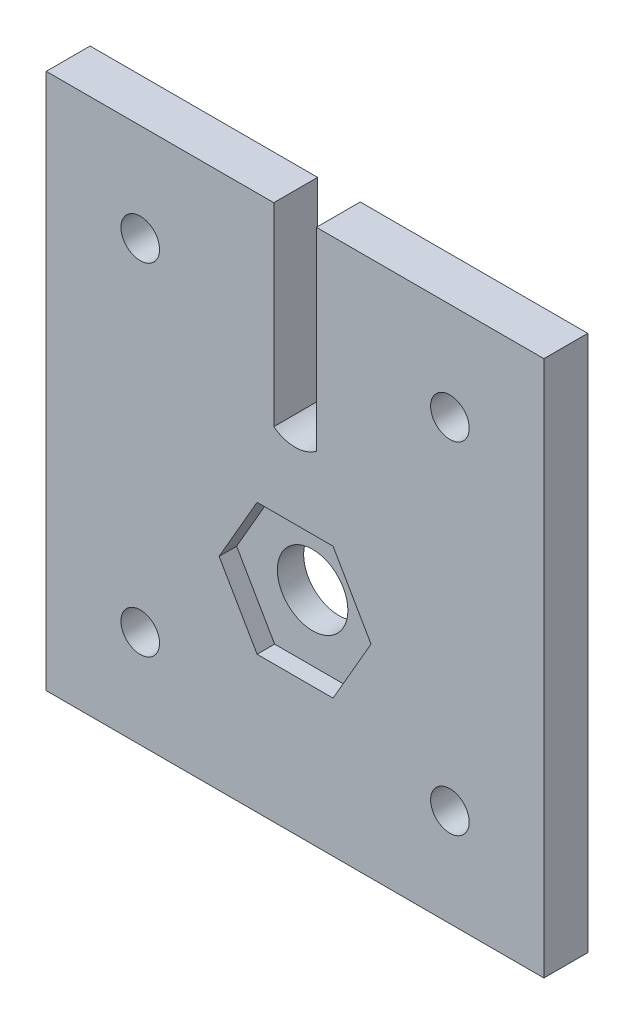
ISO-10303-21;
HEADER;
FILE_DESCRIPTION(('STEP AP214'),'2;1');
FILE_NAME('part.step','',(''),(''),'','','');
FILE_SCHEMA(('AUTOMOTIVE_DESIGN { 1 0 10303 214 1 1 1 1 }'));
ENDSEC;
DATA;
#1=APPLICATION_CONTEXT('core data for automotive mechanical design processes');
#2=APPLICATION_PROTOCOL_DEFINITION('international standard','automotive_design',2000,#1);
#3=PRODUCT_CONTEXT('',#1,'mechanical');
#4=PRODUCT('Part','Part','',(#3));
#5=PRODUCT_RELATED_PRODUCT_CATEGORY('part','',(#4));
#6=PRODUCT_DEFINITION_FORMATION('','',#4);
#7=PRODUCT_DEFINITION_CONTEXT('part definition',#1,'design');
#8=PRODUCT_DEFINITION('design','',#6,#7);
#9=PRODUCT_DEFINITION_SHAPE('','',#8);
#10=(LENGTH_UNIT() NAMED_UNIT(*) SI_UNIT(.MILLI.,.METRE.));
#11=(NAMED_UNIT(*) PLANE_ANGLE_UNIT() SI_UNIT($,.RADIAN.));
#12=(NAMED_UNIT(*) SI_UNIT($,.STERADIAN.) SOLID_ANGLE_UNIT());
#13=UNCERTAINTY_MEASURE_WITH_UNIT(LENGTH_MEASURE(1.E-05),#10,'distance_accuracy_value','');
#14=(GEOMETRIC_REPRESENTATION_CONTEXT(3) GLOBAL_UNCERTAINTY_ASSIGNED_CONTEXT((#13)) GLOBAL_UNIT_ASSIGNED_CONTEXT((#10,
#11,#12)) REPRESENTATION_CONTEXT('',''));
#15=CARTESIAN_POINT('',(0.,0.,0.));
#16=DIRECTION('',(0.,0.,1.));
#17=DIRECTION('',(1.,0.,0.));
#18=AXIS2_PLACEMENT_3D('',#15,#16,#17);
#19=CARTESIAN_POINT('',(34.7111476707963,-19.0791221600585,3.175));
#20=DIRECTION('',(0.,0.,-1.));
#21=DIRECTION('',(-1.,0.,0.));
#22=AXIS2_PLACEMENT_3D('',#19,#20,#21);
#23=CYLINDRICAL_SURFACE('',#22,2.5527);
#24=CARTESIAN_POINT('',(34.7111476707963,-19.0791221600585,0.));
#25=DIRECTION('',(0.,0.,1.));
#26=DIRECTION('',(1.,0.,0.));
#27=AXIS2_PLACEMENT_3D('',#24,#25,#26);
#28=CIRCLE('',#27,2.5527);
#29=CARTESIAN_POINT('',(37.2638476707963,-19.0791221600585,0.));
#30=VERTEX_POINT('',#29);
#31=EDGE_CURVE('E150',#30,#30,#28,.T.);
#32=ORIENTED_EDGE('',*,*,#31,.F.);
#33=EDGE_LOOP('',(#32));
#34=FACE_BOUND('',#33,.T.);
#35=CARTESIAN_POINT('',(34.7111476707963,-19.0791221600585,1.905));
#36=DIRECTION('',(0.,0.,1.));
#37=DIRECTION('',(1.,0.,0.));
#38=AXIS2_PLACEMENT_3D('',#35,#36,#37);
#39=CIRCLE('',#38,2.5527);
#40=CARTESIAN_POINT('',(37.2638476707963,-19.0791221600585,1.905));
#41=VERTEX_POINT('',#40);
#42=EDGE_CURVE('E39',#41,#41,#39,.T.);
#43=ORIENTED_EDGE('',*,*,#42,.T.);
#44=EDGE_LOOP('',(#43));
#45=FACE_BOUND('',#44,.T.);
#46=ADVANCED_FACE('F35',(#34,#45),#23,.F.);
#47=CARTESIAN_POINT('',(34.7111476707963,-6.93737555205847,3.175));
#48=DIRECTION('',(0.,0.,1.));
#49=DIRECTION('',(1.,0.,0.));
#50=AXIS2_PLACEMENT_3D('',#47,#48,#49);
#51=PLANE('',#50);
#52=DIRECTION('',(0.5,0.866025403784439,0.));
#53=VECTOR('',#52,1.);
#54=CARTESIAN_POINT('',(37.4607783278119,-23.8416221600585,3.175));
#55=LINE('',#54,#53);
#56=CARTESIAN_POINT('',(37.4607783278119,-23.8416221600585,3.175));
#57=VERTEX_POINT('',#56);
#58=CARTESIAN_POINT('',(40.2104089848275,-19.0791221600585,3.175));
#59=VERTEX_POINT('',#58);
#60=EDGE_CURVE('E51',#57,#59,#55,.T.);
#61=ORIENTED_EDGE('',*,*,#60,.F.);
#62=DIRECTION('',(1.,0.,0.));
#63=VECTOR('',#62,1.);
#64=CARTESIAN_POINT('',(31.9615170137808,-23.8416221600585,3.175));
#65=LINE('',#64,#63);
#66=CARTESIAN_POINT('',(31.9615170137808,-23.8416221600585,3.175));
#67=VERTEX_POINT('',#66);
#68=EDGE_CURVE('E240',#67,#57,#65,.T.);
#69=ORIENTED_EDGE('',*,*,#68,.F.);
#70=DIRECTION('',(0.5,-0.866025403784439,0.));
#71=VECTOR('',#70,1.);
#72=CARTESIAN_POINT('',(29.2118863567652,-19.0791221600585,3.175));
#73=LINE('',#72,#71);
#74=CARTESIAN_POINT('',(29.2118863567652,-19.0791221600585,3.175));
#75=VERTEX_POINT('',#74);
#76=EDGE_CURVE('E244',#75,#67,#73,.T.);
#77=ORIENTED_EDGE('',*,*,#76,.F.);
#78=DIRECTION('',(-0.5,-0.866025403784439,0.));
#79=VECTOR('',#78,1.);
#80=CARTESIAN_POINT('',(31.9615170137807,-14.3166221600585,3.175));
#81=LINE('',#80,#79);
#82=CARTESIAN_POINT('',(31.9615170137807,-14.3166221600585,3.175));
#83=VERTEX_POINT('',#82);
#84=EDGE_CURVE('E247',#83,#75,#81,.T.);
#85=ORIENTED_EDGE('',*,*,#84,.F.);
#86=DIRECTION('',(-1.,0.,0.));
#87=VECTOR('',#86,1.);
#88=CARTESIAN_POINT('',(37.4607783278119,-14.3166221600585,3.175));
#89=LINE('',#88,#87);
#90=CARTESIAN_POINT('',(37.4607783278119,-14.3166221600585,3.175));
#91=VERTEX_POINT('',#90);
#92=EDGE_CURVE('E250',#91,#83,#89,.T.);
#93=ORIENTED_EDGE('',*,*,#92,.F.);
#94=DIRECTION('',(-0.5,0.866025403784439,0.));
#95=VECTOR('',#94,1.);
#96=CARTESIAN_POINT('',(40.2104089848275,-19.0791221600585,3.175));
#97=LINE('',#96,#95);
#98=EDGE_CURVE('E253',#59,#91,#97,.T.);
#99=ORIENTED_EDGE('',*,*,#98,.F.);
#100=EDGE_LOOP('',(#61,#69,#77,#85,#93,#99));
#101=FACE_BOUND('',#100,.T.);
#102=CARTESIAN_POINT('',(23.5033815167566,-26.6843921091761,3.175));
#103=DIRECTION('',(0.,0.,1.));
#104=DIRECTION('',(1.,0.,0.));
#105=AXIS2_PLACEMENT_3D('',#102,#103,#104);
#106=CIRCLE('',#105,1.397);
#107=CARTESIAN_POINT('',(24.9003815167566,-26.6843921091761,3.175));
#108=VERTEX_POINT('',#107);
#109=EDGE_CURVE('E209',#108,#108,#106,.T.);
#110=ORIENTED_EDGE('',*,*,#109,.F.);
#111=EDGE_LOOP('',(#110));
#112=FACE_BOUND('',#111,.T.);
#113=CARTESIAN_POINT('',(45.9189138248361,-2.00062141277905,3.175));
#114=DIRECTION('',(0.,0.,1.));
#115=DIRECTION('',(1.,0.,0.));
#116=AXIS2_PLACEMENT_3D('',#113,#114,#115);
#117=CIRCLE('',#116,1.39700000000001);
#118=CARTESIAN_POINT('',(47.3159138248361,-2.00062141277905,3.175));
#119=VERTEX_POINT('',#118);
#120=EDGE_CURVE('E199',#119,#119,#117,.T.);
#121=ORIENTED_EDGE('',*,*,#120,.F.);
#122=EDGE_LOOP('',(#121));
#123=FACE_BOUND('',#122,.T.);
#124=DIRECTION('',(0.,-1.,0.));
#125=VECTOR('',#124,1.);
#126=CARTESIAN_POINT('',(16.6986663518038,5.07094532726984,3.175));
#127=LINE('',#126,#125);
#128=CARTESIAN_POINT('',(16.6986663518038,5.07094532726984,3.175));
#129=VERTEX_POINT('',#128);
#130=CARTESIAN_POINT('',(16.6986663518038,-33.755958849225,3.175));
#131=VERTEX_POINT('',#130);
#132=EDGE_CURVE('E163',#129,#131,#127,.T.);
#133=ORIENTED_EDGE('',*,*,#132,.T.);
#134=DIRECTION('',(1.,0.,0.));
#135=VECTOR('',#134,1.);
#136=CARTESIAN_POINT('',(16.6986663518038,-33.755958849225,3.175));
#137=LINE('',#136,#135);
#138=CARTESIAN_POINT('',(52.7236289897888,-33.755958849225,3.175));
#139=VERTEX_POINT('',#138);
#140=EDGE_CURVE('E101',#131,#139,#137,.T.);
#141=ORIENTED_EDGE('',*,*,#140,.T.);
#142=DIRECTION('',(0.,1.,0.));
#143=VECTOR('',#142,1.);
#144=CARTESIAN_POINT('',(52.7236289897888,5.07094532726984,3.175));
#145=LINE('',#144,#143);
#146=CARTESIAN_POINT('',(52.7236289897888,5.07094532726984,3.175));
#147=VERTEX_POINT('',#146);
#148=EDGE_CURVE('E179',#139,#147,#145,.T.);
#149=ORIENTED_EDGE('',*,*,#148,.T.);
#150=DIRECTION('',(-1.,0.,0.));
#151=VECTOR('',#150,1.);
#152=CARTESIAN_POINT('',(36.2536339682937,5.07094532726984,3.175));
#153=LINE('',#152,#151);
#154=CARTESIAN_POINT('',(36.2536339682937,5.07094532726984,3.175));
#155=VERTEX_POINT('',#154);
#156=EDGE_CURVE('E191',#147,#155,#153,.T.);
#157=ORIENTED_EDGE('',*,*,#156,.T.);
#158=DIRECTION('',(0.,-1.,0.));
#159=VECTOR('',#158,1.);
#160=CARTESIAN_POINT('',(36.2536339682937,-4.9034106280657,3.175));
#161=LINE('',#160,#159);
#162=CARTESIAN_POINT('',(36.2536339682937,-8.97134047605125,3.175));
#163=VERTEX_POINT('',#162);
#164=EDGE_CURVE('E125',#155,#163,#161,.T.);
#165=ORIENTED_EDGE('',*,*,#164,.T.);
#166=CARTESIAN_POINT('',(34.7111476707963,-6.93737555205847,3.175));
#167=DIRECTION('',(0.,0.,-1.));
#168=DIRECTION('',(1.,0.,0.));
#169=AXIS2_PLACEMENT_3D('',#166,#167,#168);
#170=CIRCLE('',#169,2.5527);
#171=CARTESIAN_POINT('',(33.168661373299,-8.97134047605125,3.175));
#172=VERTEX_POINT('',#171);
#173=EDGE_CURVE('E117',#163,#172,#170,.T.);
#174=ORIENTED_EDGE('',*,*,#173,.T.);
#175=DIRECTION('',(0.,1.,0.));
#176=VECTOR('',#175,1.);
#177=CARTESIAN_POINT('',(33.168661373299,-4.9034106280657,3.175));
#178=LINE('',#177,#176);
#179=CARTESIAN_POINT('',(33.168661373299,5.07094532726984,3.175));
#180=VERTEX_POINT('',#179);
#181=EDGE_CURVE('E122',#172,#180,#178,.T.);
#182=ORIENTED_EDGE('',*,*,#181,.T.);
#183=DIRECTION('',(-1.,0.,0.));
#184=VECTOR('',#183,1.);
#185=CARTESIAN_POINT('',(16.6986663518038,5.07094532726984,3.175));
#186=LINE('',#185,#184);
#187=EDGE_CURVE('E60',#180,#129,#186,.T.);
#188=ORIENTED_EDGE('',*,*,#187,.T.);
#189=EDGE_LOOP('',(#133,#141,#149,#157,#165,#174,#182,#188));
#190=FACE_BOUND('',#189,.T.);
#191=CARTESIAN_POINT('',(23.5033815167566,-2.00062141277905,3.175));
#192=DIRECTION('',(0.,0.,1.));
#193=DIRECTION('',(1.,0.,0.));
#194=AXIS2_PLACEMENT_3D('',#191,#192,#193);
#195=CIRCLE('',#194,1.397);
#196=CARTESIAN_POINT('',(24.9003815167566,-2.00062141277905,3.175));
#197=VERTEX_POINT('',#196);
#198=EDGE_CURVE('E203',#197,#197,#195,.T.);
#199=ORIENTED_EDGE('',*,*,#198,.F.);
#200=EDGE_LOOP('',(#199));
#201=FACE_BOUND('',#200,.T.);
#202=CARTESIAN_POINT('',(45.9189138248361,-26.6843921091761,3.175));
#203=DIRECTION('',(0.,0.,1.));
#204=DIRECTION('',(1.,0.,0.));
#205=AXIS2_PLACEMENT_3D('',#202,#203,#204);
#206=CIRCLE('',#205,1.39700000000001);
#207=CARTESIAN_POINT('',(47.3159138248361,-26.6843921091761,3.175));
#208=VERTEX_POINT('',#207);
#209=EDGE_CURVE('E215',#208,#208,#206,.T.);
#210=ORIENTED_EDGE('',*,*,#209,.F.);
#211=EDGE_LOOP('',(#210));
#212=FACE_BOUND('',#211,.T.);
#213=ADVANCED_FACE('F119',(#101,#112,#123,#190,#201,#212),#51,.T.);
#214=CARTESIAN_POINT('',(34.7111476707963,-6.93737555205847,0.));
#215=DIRECTION('',(0.,0.,1.));
#216=DIRECTION('',(1.,0.,0.));
#217=AXIS2_PLACEMENT_3D('',#214,#215,#216);
#218=PLANE('',#217);
#219=CARTESIAN_POINT('',(23.5033815167566,-26.6843921091761,0.));
#220=DIRECTION('',(0.,0.,1.));
#221=DIRECTION('',(1.,0.,0.));
#222=AXIS2_PLACEMENT_3D('',#219,#220,#221);
#223=CIRCLE('',#222,1.397);
#224=CARTESIAN_POINT('',(24.9003815167566,-26.6843921091761,0.));
#225=VERTEX_POINT('',#224);
#226=EDGE_CURVE('E212',#225,#225,#223,.T.);
#227=ORIENTED_EDGE('',*,*,#226,.T.);
#228=EDGE_LOOP('',(#227));
#229=FACE_BOUND('',#228,.T.);
#230=CARTESIAN_POINT('',(45.9189138248361,-2.00062141277905,0.));
#231=DIRECTION('',(0.,0.,1.));
#232=DIRECTION('',(1.,0.,0.));
#233=AXIS2_PLACEMENT_3D('',#230,#231,#232);
#234=CIRCLE('',#233,1.39700000000001);
#235=CARTESIAN_POINT('',(47.3159138248361,-2.00062141277905,0.));
#236=VERTEX_POINT('',#235);
#237=EDGE_CURVE('E200',#236,#236,#234,.T.);
#238=ORIENTED_EDGE('',*,*,#237,.T.);
#239=EDGE_LOOP('',(#238));
#240=FACE_BOUND('',#239,.T.);
#241=DIRECTION('',(0.,-1.,0.));
#242=VECTOR('',#241,1.);
#243=CARTESIAN_POINT('',(16.6986663518038,5.07094532726984,0.));
#244=LINE('',#243,#242);
#245=CARTESIAN_POINT('',(16.6986663518038,5.07094532726984,0.));
#246=VERTEX_POINT('',#245);
#247=CARTESIAN_POINT('',(16.6986663518038,-33.755958849225,0.));
#248=VERTEX_POINT('',#247);
#249=EDGE_CURVE('E146',#246,#248,#244,.T.);
#250=ORIENTED_EDGE('',*,*,#249,.F.);
#251=DIRECTION('',(-1.,0.,0.));
#252=VECTOR('',#251,1.);
#253=CARTESIAN_POINT('',(16.6986663518038,5.07094532726984,0.));
#254=LINE('',#253,#252);
#255=CARTESIAN_POINT('',(33.168661373299,5.07094532726984,0.));
#256=VERTEX_POINT('',#255);
#257=EDGE_CURVE('E93',#256,#246,#254,.T.);
#258=ORIENTED_EDGE('',*,*,#257,.F.);
#259=DIRECTION('',(0.,1.,0.));
#260=VECTOR('',#259,1.);
#261=CARTESIAN_POINT('',(33.168661373299,-4.9034106280657,0.));
#262=LINE('',#261,#260);
#263=CARTESIAN_POINT('',(33.168661373299,-8.97134047605125,0.));
#264=VERTEX_POINT('',#263);
#265=EDGE_CURVE('E160',#264,#256,#262,.T.);
#266=ORIENTED_EDGE('',*,*,#265,.F.);
#267=CARTESIAN_POINT('',(34.7111476707963,-6.93737555205847,0.));
#268=DIRECTION('',(0.,0.,-1.));
#269=DIRECTION('',(1.,0.,0.));
#270=AXIS2_PLACEMENT_3D('',#267,#268,#269);
#271=CIRCLE('',#270,2.5527);
#272=CARTESIAN_POINT('',(36.2536339682937,-8.97134047605125,0.));
#273=VERTEX_POINT('',#272);
#274=EDGE_CURVE('E135',#273,#264,#271,.T.);
#275=ORIENTED_EDGE('',*,*,#274,.F.);
#276=DIRECTION('',(0.,-1.,0.));
#277=VECTOR('',#276,1.);
#278=CARTESIAN_POINT('',(36.2536339682937,-4.9034106280657,0.));
#279=LINE('',#278,#277);
#280=CARTESIAN_POINT('',(36.2536339682937,5.07094532726984,0.));
#281=VERTEX_POINT('',#280);
#282=EDGE_CURVE('E157',#281,#273,#279,.T.);
#283=ORIENTED_EDGE('',*,*,#282,.F.);
#284=DIRECTION('',(-1.,0.,0.));
#285=VECTOR('',#284,1.);
#286=CARTESIAN_POINT('',(36.2536339682937,5.07094532726984,0.));
#287=LINE('',#286,#285);
#288=CARTESIAN_POINT('',(52.7236289897888,5.07094532726984,0.));
#289=VERTEX_POINT('',#288);
#290=EDGE_CURVE('E154',#289,#281,#287,.T.);
#291=ORIENTED_EDGE('',*,*,#290,.F.);
#292=DIRECTION('',(0.,1.,0.));
#293=VECTOR('',#292,1.);
#294=CARTESIAN_POINT('',(52.7236289897888,5.07094532726984,0.));
#295=LINE('',#294,#293);
#296=CARTESIAN_POINT('',(52.7236289897888,-33.755958849225,0.));
#297=VERTEX_POINT('',#296);
#298=EDGE_CURVE('E152',#297,#289,#295,.T.);
#299=ORIENTED_EDGE('',*,*,#298,.F.);
#300=DIRECTION('',(1.,0.,0.));
#301=VECTOR('',#300,1.);
#302=CARTESIAN_POINT('',(16.6986663518038,-33.755958849225,0.));
#303=LINE('',#302,#301);
#304=EDGE_CURVE('E149',#248,#297,#303,.T.);
#305=ORIENTED_EDGE('',*,*,#304,.F.);
#306=EDGE_LOOP('',(#250,#258,#266,#275,#283,#291,#299,#305));
#307=FACE_BOUND('',#306,.T.);
#308=ORIENTED_EDGE('',*,*,#31,.T.);
#309=EDGE_LOOP('',(#308));
#310=FACE_BOUND('',#309,.T.);
#311=CARTESIAN_POINT('',(23.5033815167566,-2.00062141277905,0.));
#312=DIRECTION('',(0.,0.,1.));
#313=DIRECTION('',(1.,0.,0.));
#314=AXIS2_PLACEMENT_3D('',#311,#312,#313);
#315=CIRCLE('',#314,1.397);
#316=CARTESIAN_POINT('',(24.9003815167566,-2.00062141277905,0.));
#317=VERTEX_POINT('',#316);
#318=EDGE_CURVE('E206',#317,#317,#315,.T.);
#319=ORIENTED_EDGE('',*,*,#318,.T.);
#320=EDGE_LOOP('',(#319));
#321=FACE_BOUND('',#320,.T.);
#322=CARTESIAN_POINT('',(45.9189138248361,-26.6843921091761,0.));
#323=DIRECTION('',(0.,0.,1.));
#324=DIRECTION('',(1.,0.,0.));
#325=AXIS2_PLACEMENT_3D('',#322,#323,#324);
#326=CIRCLE('',#325,1.39700000000001);
#327=CARTESIAN_POINT('',(47.3159138248361,-26.6843921091761,0.));
#328=VERTEX_POINT('',#327);
#329=EDGE_CURVE('E218',#328,#328,#326,.T.);
#330=ORIENTED_EDGE('',*,*,#329,.T.);
#331=EDGE_LOOP('',(#330));
#332=FACE_BOUND('',#331,.T.);
#333=ADVANCED_FACE('F183',(#229,#240,#307,#310,#321,#332),#218,.F.);
#334=CARTESIAN_POINT('',(16.6986663518038,5.07094532726984,3.175));
#335=DIRECTION('',(1.,0.,0.));
#336=DIRECTION('',(0.,0.,-1.));
#337=AXIS2_PLACEMENT_3D('',#334,#335,#336);
#338=PLANE('',#337);
#339=ORIENTED_EDGE('',*,*,#249,.T.);
#340=DIRECTION('',(0.,0.,-1.));
#341=VECTOR('',#340,1.);
#342=CARTESIAN_POINT('',(16.6986663518038,-33.755958849225,3.175));
#343=LINE('',#342,#341);
#344=EDGE_CURVE('E11',#131,#248,#343,.T.);
#345=ORIENTED_EDGE('',*,*,#344,.F.);
#346=ORIENTED_EDGE('',*,*,#132,.F.);
#347=DIRECTION('',(0.,0.,-1.));
#348=VECTOR('',#347,1.);
#349=CARTESIAN_POINT('',(16.6986663518038,5.07094532726984,3.175));
#350=LINE('',#349,#348);
#351=EDGE_CURVE('E142',#129,#246,#350,.T.);
#352=ORIENTED_EDGE('',*,*,#351,.T.);
#353=EDGE_LOOP('',(#339,#345,#346,#352));
#354=FACE_BOUND('',#353,.T.);
#355=ADVANCED_FACE('F37',(#354),#338,.F.);
#356=CARTESIAN_POINT('',(16.6986663518038,-33.755958849225,3.175));
#357=DIRECTION('',(0.,1.,0.));
#358=DIRECTION('',(0.,0.,1.));
#359=AXIS2_PLACEMENT_3D('',#356,#357,#358);
#360=PLANE('',#359);
#361=ORIENTED_EDGE('',*,*,#304,.T.);
#362=DIRECTION('',(0.,0.,-1.));
#363=VECTOR('',#362,1.);
#364=CARTESIAN_POINT('',(52.7236289897888,-33.755958849225,3.175));
#365=LINE('',#364,#363);
#366=EDGE_CURVE('E44',#139,#297,#365,.T.);
#367=ORIENTED_EDGE('',*,*,#366,.F.);
#368=ORIENTED_EDGE('',*,*,#140,.F.);
#369=ORIENTED_EDGE('',*,*,#344,.T.);
#370=EDGE_LOOP('',(#361,#367,#368,#369));
#371=FACE_BOUND('',#370,.T.);
#372=ADVANCED_FACE('F357',(#371),#360,.F.);
#373=CARTESIAN_POINT('',(52.7236289897888,5.07094532726984,3.175));
#374=DIRECTION('',(-1.,0.,0.));
#375=DIRECTION('',(0.,0.,1.));
#376=AXIS2_PLACEMENT_3D('',#373,#374,#375);
#377=PLANE('',#376);
#378=ORIENTED_EDGE('',*,*,#298,.T.);
#379=DIRECTION('',(0.,0.,-1.));
#380=VECTOR('',#379,1.);
#381=CARTESIAN_POINT('',(52.7236289897888,5.07094532726984,3.175));
#382=LINE('',#381,#380);
#383=EDGE_CURVE('E170',#147,#289,#382,.T.);
#384=ORIENTED_EDGE('',*,*,#383,.F.);
#385=ORIENTED_EDGE('',*,*,#148,.F.);
#386=ORIENTED_EDGE('',*,*,#366,.T.);
#387=EDGE_LOOP('',(#378,#384,#385,#386));
#388=FACE_BOUND('',#387,.T.);
#389=ADVANCED_FACE('F177',(#388),#377,.F.);
#390=CARTESIAN_POINT('',(36.2536339682937,5.07094532726984,3.175));
#391=DIRECTION('',(0.,-1.,0.));
#392=DIRECTION('',(0.,0.,-1.));
#393=AXIS2_PLACEMENT_3D('',#390,#391,#392);
#394=PLANE('',#393);
#395=ORIENTED_EDGE('',*,*,#290,.T.);
#396=DIRECTION('',(0.,0.,-1.));
#397=VECTOR('',#396,1.);
#398=CARTESIAN_POINT('',(36.2536339682937,5.07094532726984,3.175));
#399=LINE('',#398,#397);
#400=EDGE_CURVE('E167',#155,#281,#399,.T.);
#401=ORIENTED_EDGE('',*,*,#400,.F.);
#402=ORIENTED_EDGE('',*,*,#156,.F.);
#403=ORIENTED_EDGE('',*,*,#383,.T.);
#404=EDGE_LOOP('',(#395,#401,#402,#403));
#405=FACE_BOUND('',#404,.T.);
#406=ADVANCED_FACE('F187',(#405),#394,.F.);
#407=CARTESIAN_POINT('',(36.2536339682937,-4.9034106280657,3.175));
#408=DIRECTION('',(1.,0.,0.));
#409=DIRECTION('',(0.,0.,-1.));
#410=AXIS2_PLACEMENT_3D('',#407,#408,#409);
#411=PLANE('',#410);
#412=ORIENTED_EDGE('',*,*,#282,.T.);
#413=DIRECTION('',(0.,0.,-1.));
#414=VECTOR('',#413,1.);
#415=CARTESIAN_POINT('',(36.2536339682937,-8.97134047605125,3.175));
#416=LINE('',#415,#414);
#417=EDGE_CURVE('E137',#163,#273,#416,.T.);
#418=ORIENTED_EDGE('',*,*,#417,.F.);
#419=ORIENTED_EDGE('',*,*,#164,.F.);
#420=ORIENTED_EDGE('',*,*,#400,.T.);
#421=EDGE_LOOP('',(#412,#418,#419,#420));
#422=FACE_BOUND('',#421,.T.);
#423=ADVANCED_FACE('F190',(#422),#411,.F.);
#424=CARTESIAN_POINT('',(34.7111476707963,-6.93737555205847,3.175));
#425=DIRECTION('',(0.,0.,-1.));
#426=DIRECTION('',(-1.,0.,0.));
#427=AXIS2_PLACEMENT_3D('',#424,#425,#426);
#428=CYLINDRICAL_SURFACE('',#427,2.5527);
#429=ORIENTED_EDGE('',*,*,#274,.T.);
#430=DIRECTION('',(0.,0.,-1.));
#431=VECTOR('',#430,1.);
#432=CARTESIAN_POINT('',(33.168661373299,-8.97134047605125,3.175));
#433=LINE('',#432,#431);
#434=EDGE_CURVE('E132',#172,#264,#433,.T.);
#435=ORIENTED_EDGE('',*,*,#434,.F.);
#436=ORIENTED_EDGE('',*,*,#173,.F.);
#437=ORIENTED_EDGE('',*,*,#417,.T.);
#438=EDGE_LOOP('',(#429,#435,#436,#437));
#439=FACE_BOUND('',#438,.T.);
#440=ADVANCED_FACE('F133',(#439),#428,.F.);
#441=CARTESIAN_POINT('',(33.168661373299,-4.9034106280657,3.175));
#442=DIRECTION('',(-1.,0.,0.));
#443=DIRECTION('',(0.,0.,1.));
#444=AXIS2_PLACEMENT_3D('',#441,#442,#443);
#445=PLANE('',#444);
#446=ORIENTED_EDGE('',*,*,#265,.T.);
#447=DIRECTION('',(0.,0.,-1.));
#448=VECTOR('',#447,1.);
#449=CARTESIAN_POINT('',(33.168661373299,5.07094532726984,3.175));
#450=LINE('',#449,#448);
#451=EDGE_CURVE('E138',#180,#256,#450,.T.);
#452=ORIENTED_EDGE('',*,*,#451,.F.);
#453=ORIENTED_EDGE('',*,*,#181,.F.);
#454=ORIENTED_EDGE('',*,*,#434,.T.);
#455=EDGE_LOOP('',(#446,#452,#453,#454));
#456=FACE_BOUND('',#455,.T.);
#457=ADVANCED_FACE('F140',(#456),#445,.F.);
#458=CARTESIAN_POINT('',(16.6986663518038,5.07094532726984,3.175));
#459=DIRECTION('',(0.,-1.,0.));
#460=DIRECTION('',(0.,0.,-1.));
#461=AXIS2_PLACEMENT_3D('',#458,#459,#460);
#462=PLANE('',#461);
#463=ORIENTED_EDGE('',*,*,#257,.T.);
#464=ORIENTED_EDGE('',*,*,#351,.F.);
#465=ORIENTED_EDGE('',*,*,#187,.F.);
#466=ORIENTED_EDGE('',*,*,#451,.T.);
#467=EDGE_LOOP('',(#463,#464,#465,#466));
#468=FACE_BOUND('',#467,.T.);
#469=ADVANCED_FACE('F345',(#468),#462,.F.);
#470=CARTESIAN_POINT('',(45.9189138248361,-2.00062141277905,3.175));
#471=DIRECTION('',(0.,0.,-1.));
#472=DIRECTION('',(-1.,0.,0.));
#473=AXIS2_PLACEMENT_3D('',#470,#471,#472);
#474=CYLINDRICAL_SURFACE('',#473,1.39700000000001);
#475=ORIENTED_EDGE('',*,*,#120,.T.);
#476=EDGE_LOOP('',(#475));
#477=FACE_BOUND('',#476,.T.);
#478=ORIENTED_EDGE('',*,*,#237,.F.);
#479=EDGE_LOOP('',(#478));
#480=FACE_BOUND('',#479,.T.);
#481=ADVANCED_FACE('F339',(#477,#480),#474,.F.);
#482=CARTESIAN_POINT('',(23.5033815167566,-2.00062141277905,3.175));
#483=DIRECTION('',(0.,0.,-1.));
#484=DIRECTION('',(-1.,0.,0.));
#485=AXIS2_PLACEMENT_3D('',#482,#483,#484);
#486=CYLINDRICAL_SURFACE('',#485,1.397);
#487=ORIENTED_EDGE('',*,*,#198,.T.);
#488=EDGE_LOOP('',(#487));
#489=FACE_BOUND('',#488,.T.);
#490=ORIENTED_EDGE('',*,*,#318,.F.);
#491=EDGE_LOOP('',(#490));
#492=FACE_BOUND('',#491,.T.);
#493=ADVANCED_FACE('F442',(#489,#492),#486,.F.);
#494=CARTESIAN_POINT('',(23.5033815167566,-26.6843921091761,3.175));
#495=DIRECTION('',(0.,0.,-1.));
#496=DIRECTION('',(-1.,0.,0.));
#497=AXIS2_PLACEMENT_3D('',#494,#495,#496);
#498=CYLINDRICAL_SURFACE('',#497,1.397);
#499=ORIENTED_EDGE('',*,*,#109,.T.);
#500=EDGE_LOOP('',(#499));
#501=FACE_BOUND('',#500,.T.);
#502=ORIENTED_EDGE('',*,*,#226,.F.);
#503=EDGE_LOOP('',(#502));
#504=FACE_BOUND('',#503,.T.);
#505=ADVANCED_FACE('F439',(#501,#504),#498,.F.);
#506=CARTESIAN_POINT('',(45.9189138248361,-26.6843921091761,3.175));
#507=DIRECTION('',(0.,0.,-1.));
#508=DIRECTION('',(-1.,0.,0.));
#509=AXIS2_PLACEMENT_3D('',#506,#507,#508);
#510=CYLINDRICAL_SURFACE('',#509,1.39700000000001);
#511=ORIENTED_EDGE('',*,*,#209,.T.);
#512=EDGE_LOOP('',(#511));
#513=FACE_BOUND('',#512,.T.);
#514=ORIENTED_EDGE('',*,*,#329,.F.);
#515=EDGE_LOOP('',(#514));
#516=FACE_BOUND('',#515,.T.);
#517=ADVANCED_FACE('F389',(#513,#516),#510,.F.);
#518=CARTESIAN_POINT('',(37.4607783278119,-23.8416221600585,1.905));
#519=DIRECTION('',(0.866025403784439,-0.5,0.));
#520=DIRECTION('',(0.5,0.866025403784439,0.));
#521=AXIS2_PLACEMENT_3D('',#518,#519,#520);
#522=PLANE('',#521);
#523=ORIENTED_EDGE('',*,*,#60,.T.);
#524=DIRECTION('',(0.,0.,1.));
#525=VECTOR('',#524,1.);
#526=CARTESIAN_POINT('',(40.2104089848275,-19.0791221600585,1.905));
#527=LINE('',#526,#525);
#528=CARTESIAN_POINT('',(40.2104089848275,-19.0791221600585,1.905));
#529=VERTEX_POINT('',#528);
#530=EDGE_CURVE('E223',#529,#59,#527,.T.);
#531=ORIENTED_EDGE('',*,*,#530,.F.);
#532=DIRECTION('',(0.5,0.866025403784439,0.));
#533=VECTOR('',#532,1.);
#534=CARTESIAN_POINT('',(37.4607783278119,-23.8416221600585,1.905));
#535=LINE('',#534,#533);
#536=CARTESIAN_POINT('',(37.4607783278119,-23.8416221600585,1.905));
#537=VERTEX_POINT('',#536);
#538=EDGE_CURVE('E243',#537,#529,#535,.T.);
#539=ORIENTED_EDGE('',*,*,#538,.F.);
#540=DIRECTION('',(0.,0.,1.));
#541=VECTOR('',#540,1.);
#542=CARTESIAN_POINT('',(37.4607783278119,-23.8416221600585,1.905));
#543=LINE('',#542,#541);
#544=EDGE_CURVE('E238',#537,#57,#543,.T.);
#545=ORIENTED_EDGE('',*,*,#544,.T.);
#546=EDGE_LOOP('',(#523,#531,#539,#545));
#547=FACE_BOUND('',#546,.T.);
#548=ADVANCED_FACE('F280',(#547),#522,.F.);
#549=CARTESIAN_POINT('',(31.9615170137808,-23.8416221600585,1.905));
#550=DIRECTION('',(0.,-1.,0.));
#551=DIRECTION('',(0.,0.,-1.));
#552=AXIS2_PLACEMENT_3D('',#549,#550,#551);
#553=PLANE('',#552);
#554=ORIENTED_EDGE('',*,*,#68,.T.);
#555=ORIENTED_EDGE('',*,*,#544,.F.);
#556=DIRECTION('',(1.,0.,0.));
#557=VECTOR('',#556,1.);
#558=CARTESIAN_POINT('',(31.9615170137808,-23.8416221600585,1.905));
#559=LINE('',#558,#557);
#560=CARTESIAN_POINT('',(31.9615170137808,-23.8416221600585,1.905));
#561=VERTEX_POINT('',#560);
#562=EDGE_CURVE('E226',#561,#537,#559,.T.);
#563=ORIENTED_EDGE('',*,*,#562,.F.);
#564=DIRECTION('',(0.,0.,1.));
#565=VECTOR('',#564,1.);
#566=CARTESIAN_POINT('',(31.9615170137808,-23.8416221600585,1.905));
#567=LINE('',#566,#565);
#568=EDGE_CURVE('E235',#561,#67,#567,.T.);
#569=ORIENTED_EDGE('',*,*,#568,.T.);
#570=EDGE_LOOP('',(#554,#555,#563,#569));
#571=FACE_BOUND('',#570,.T.);
#572=ADVANCED_FACE('F296',(#571),#553,.F.);
#573=CARTESIAN_POINT('',(29.2118863567652,-19.0791221600585,1.905));
#574=DIRECTION('',(-0.866025403784439,-0.5,0.));
#575=DIRECTION('',(0.5,-0.866025403784439,0.));
#576=AXIS2_PLACEMENT_3D('',#573,#574,#575);
#577=PLANE('',#576);
#578=ORIENTED_EDGE('',*,*,#76,.T.);
#579=ORIENTED_EDGE('',*,*,#568,.F.);
#580=DIRECTION('',(0.5,-0.866025403784439,0.));
#581=VECTOR('',#580,1.);
#582=CARTESIAN_POINT('',(29.2118863567652,-19.0791221600585,1.905));
#583=LINE('',#582,#581);
#584=CARTESIAN_POINT('',(29.2118863567652,-19.0791221600585,1.905));
#585=VERTEX_POINT('',#584);
#586=EDGE_CURVE('E259',#585,#561,#583,.T.);
#587=ORIENTED_EDGE('',*,*,#586,.F.);
#588=DIRECTION('',(0.,0.,1.));
#589=VECTOR('',#588,1.);
#590=CARTESIAN_POINT('',(29.2118863567652,-19.0791221600585,1.905));
#591=LINE('',#590,#589);
#592=EDGE_CURVE('E232',#585,#75,#591,.T.);
#593=ORIENTED_EDGE('',*,*,#592,.T.);
#594=EDGE_LOOP('',(#578,#579,#587,#593));
#595=FACE_BOUND('',#594,.T.);
#596=ADVANCED_FACE('F301',(#595),#577,.F.);
#597=CARTESIAN_POINT('',(31.9615170137807,-14.3166221600585,1.905));
#598=DIRECTION('',(-0.866025403784439,0.5,0.));
#599=DIRECTION('',(-0.5,-0.866025403784439,0.));
#600=AXIS2_PLACEMENT_3D('',#597,#598,#599);
#601=PLANE('',#600);
#602=ORIENTED_EDGE('',*,*,#84,.T.);
#603=ORIENTED_EDGE('',*,*,#592,.F.);
#604=DIRECTION('',(-0.5,-0.866025403784439,0.));
#605=VECTOR('',#604,1.);
#606=CARTESIAN_POINT('',(31.9615170137807,-14.3166221600585,1.905));
#607=LINE('',#606,#605);
#608=CARTESIAN_POINT('',(31.9615170137807,-14.3166221600585,1.905));
#609=VERTEX_POINT('',#608);
#610=EDGE_CURVE('E262',#609,#585,#607,.T.);
#611=ORIENTED_EDGE('',*,*,#610,.F.);
#612=DIRECTION('',(0.,0.,1.));
#613=VECTOR('',#612,1.);
#614=CARTESIAN_POINT('',(31.9615170137807,-14.3166221600585,1.905));
#615=LINE('',#614,#613);
#616=EDGE_CURVE('E229',#609,#83,#615,.T.);
#617=ORIENTED_EDGE('',*,*,#616,.T.);
#618=EDGE_LOOP('',(#602,#603,#611,#617));
#619=FACE_BOUND('',#618,.T.);
#620=ADVANCED_FACE('F320',(#619),#601,.F.);
#621=CARTESIAN_POINT('',(37.4607783278119,-14.3166221600585,1.905));
#622=DIRECTION('',(0.,1.,0.));
#623=DIRECTION('',(0.,0.,1.));
#624=AXIS2_PLACEMENT_3D('',#621,#622,#623);
#625=PLANE('',#624);
#626=ORIENTED_EDGE('',*,*,#92,.T.);
#627=ORIENTED_EDGE('',*,*,#616,.F.);
#628=DIRECTION('',(-1.,0.,0.));
#629=VECTOR('',#628,1.);
#630=CARTESIAN_POINT('',(37.4607783278119,-14.3166221600585,1.905));
#631=LINE('',#630,#629);
#632=CARTESIAN_POINT('',(37.4607783278119,-14.3166221600585,1.905));
#633=VERTEX_POINT('',#632);
#634=EDGE_CURVE('E265',#633,#609,#631,.T.);
#635=ORIENTED_EDGE('',*,*,#634,.F.);
#636=DIRECTION('',(0.,0.,1.));
#637=VECTOR('',#636,1.);
#638=CARTESIAN_POINT('',(37.4607783278119,-14.3166221600585,1.905));
#639=LINE('',#638,#637);
#640=EDGE_CURVE('E225',#633,#91,#639,.T.);
#641=ORIENTED_EDGE('',*,*,#640,.T.);
#642=EDGE_LOOP('',(#626,#627,#635,#641));
#643=FACE_BOUND('',#642,.T.);
#644=ADVANCED_FACE('F316',(#643),#625,.F.);
#645=CARTESIAN_POINT('',(40.2104089848275,-19.0791221600585,1.905));
#646=DIRECTION('',(0.866025403784439,0.5,0.));
#647=DIRECTION('',(-0.5,0.866025403784439,0.));
#648=AXIS2_PLACEMENT_3D('',#645,#646,#647);
#649=PLANE('',#648);
#650=ORIENTED_EDGE('',*,*,#98,.T.);
#651=ORIENTED_EDGE('',*,*,#640,.F.);
#652=DIRECTION('',(-0.5,0.866025403784439,0.));
#653=VECTOR('',#652,1.);
#654=CARTESIAN_POINT('',(40.2104089848275,-19.0791221600585,1.905));
#655=LINE('',#654,#653);
#656=EDGE_CURVE('E268',#529,#633,#655,.T.);
#657=ORIENTED_EDGE('',*,*,#656,.F.);
#658=ORIENTED_EDGE('',*,*,#530,.T.);
#659=EDGE_LOOP('',(#650,#651,#657,#658));
#660=FACE_BOUND('',#659,.T.);
#661=ADVANCED_FACE('F310',(#660),#649,.F.);
#662=CARTESIAN_POINT('',(0.,0.,1.905));
#663=DIRECTION('',(0.,0.,1.));
#664=DIRECTION('',(1.,0.,0.));
#665=AXIS2_PLACEMENT_3D('',#662,#663,#664);
#666=PLANE('',#665);
#667=ORIENTED_EDGE('',*,*,#42,.F.);
#668=EDGE_LOOP('',(#667));
#669=FACE_BOUND('',#668,.T.);
#670=ORIENTED_EDGE('',*,*,#538,.T.);
#671=ORIENTED_EDGE('',*,*,#656,.T.);
#672=ORIENTED_EDGE('',*,*,#634,.T.);
#673=ORIENTED_EDGE('',*,*,#610,.T.);
#674=ORIENTED_EDGE('',*,*,#586,.T.);
#675=ORIENTED_EDGE('',*,*,#562,.T.);
#676=EDGE_LOOP('',(#670,#671,#672,#673,#674,#675));
#677=FACE_BOUND('',#676,.T.);
#678=ADVANCED_FACE('F275',(#669,#677),#666,.T.);
#679=CLOSED_SHELL('',(#46,#213,#333,#355,#372,#389,#406,#423,#440,#457,#469,#481,#493,#505,#517,
#548,#572,#596,#620,#644,#661,#678));
#680=MANIFOLD_SOLID_BREP('B2',#679);
#681=ADVANCED_BREP_SHAPE_REPRESENTATION('',(#18,#680),#14);
#682=SHAPE_DEFINITION_REPRESENTATION(#9,#681);
ENDSEC;
END-ISO-10303-21;
